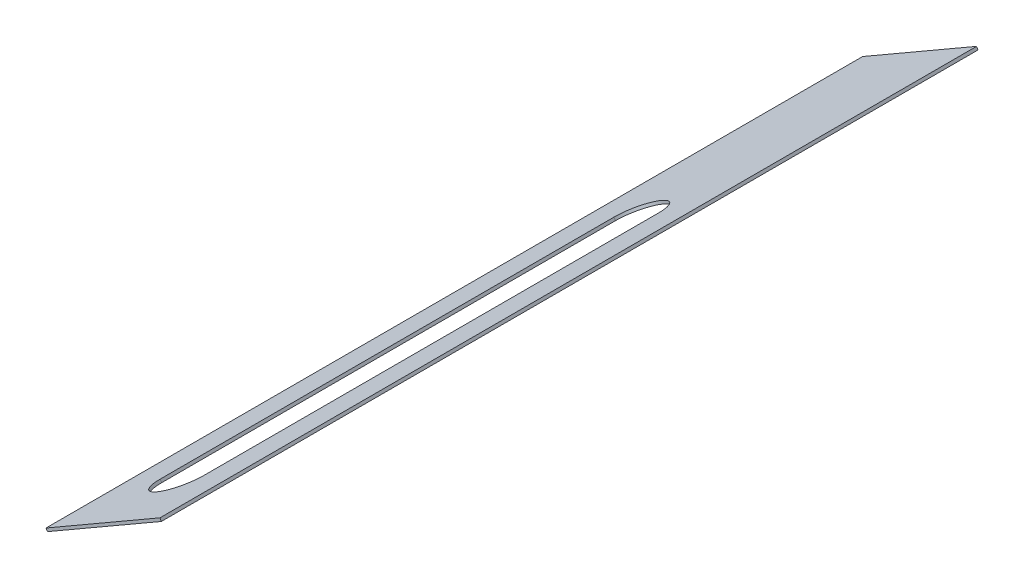
ISO-10303-21;
HEADER;
FILE_DESCRIPTION(('STEP AP214'),'2;1');
FILE_NAME('part.step','',(''),(''),'','','');
FILE_SCHEMA(('AUTOMOTIVE_DESIGN { 1 0 10303 214 1 1 1 1 }'));
ENDSEC;
DATA;
#1=APPLICATION_CONTEXT('core data for automotive mechanical design processes');
#2=APPLICATION_PROTOCOL_DEFINITION('international standard','automotive_design',2000,#1);
#3=PRODUCT_CONTEXT('',#1,'mechanical');
#4=PRODUCT('Part','Part','',(#3));
#5=PRODUCT_RELATED_PRODUCT_CATEGORY('part','',(#4));
#6=PRODUCT_DEFINITION_FORMATION('','',#4);
#7=PRODUCT_DEFINITION_CONTEXT('part definition',#1,'design');
#8=PRODUCT_DEFINITION('design','',#6,#7);
#9=PRODUCT_DEFINITION_SHAPE('','',#8);
#10=(LENGTH_UNIT() NAMED_UNIT(*) SI_UNIT(.MILLI.,.METRE.));
#11=(NAMED_UNIT(*) PLANE_ANGLE_UNIT() SI_UNIT($,.RADIAN.));
#12=(NAMED_UNIT(*) SI_UNIT($,.STERADIAN.) SOLID_ANGLE_UNIT());
#13=UNCERTAINTY_MEASURE_WITH_UNIT(LENGTH_MEASURE(1.E-05),#10,'distance_accuracy_value','');
#14=(GEOMETRIC_REPRESENTATION_CONTEXT(3) GLOBAL_UNCERTAINTY_ASSIGNED_CONTEXT((#13)) GLOBAL_UNIT_ASSIGNED_CONTEXT((#10,
#11,#12)) REPRESENTATION_CONTEXT('',''));
#15=CARTESIAN_POINT('',(0.,0.,0.));
#16=DIRECTION('',(0.,0.,1.));
#17=DIRECTION('',(1.,0.,0.));
#18=AXIS2_PLACEMENT_3D('',#15,#16,#17);
#19=CARTESIAN_POINT('',(-130.757862485378,226.479261314054,914.4));
#20=DIRECTION('',(-0.500000000000017,0.866025403784429,0.));
#21=DIRECTION('',(-0.866025403784429,-0.500000000000017,0.));
#22=AXIS2_PLACEMENT_3D('',#19,#20,#21);
#23=PLANE('',#22);
#24=DIRECTION('',(0.,0.,1.));
#25=VECTOR('',#24,1.);
#26=CARTESIAN_POINT('',(-180.25121429099,197.904261326357,883.505362503567));
#27=LINE('',#26,#25);
#28=CARTESIAN_POINT('',(-180.251214291125,197.904261326591,1650.99999999886));
#29=VERTEX_POINT('',#28);
#30=CARTESIAN_POINT('',(-180.251214277113,197.904261335004,635.000000000381));
#31=VERTEX_POINT('',#30);
#32=EDGE_CURVE('E96',#29,#31,#27,.F.);
#33=ORIENTED_EDGE('',*,*,#32,.T.);
#34=CARTESIAN_POINT('',(-130.757862436667,226.479261343172,635.));
#35=DIRECTION('',(0.500000000000017,-0.866025403784429,0.));
#36=DIRECTION('',(0.866025403784429,0.500000000000017,0.));
#37=AXIS2_PLACEMENT_3D('',#34,#35,#36);
#38=CIRCLE('',#37,57.15);
#39=CARTESIAN_POINT('',(-81.2645107725689,255.054261249474,634.999999999365));
#40=VERTEX_POINT('',#39);
#41=EDGE_CURVE('E95',#31,#40,#38,.T.);
#42=ORIENTED_EDGE('',*,*,#41,.T.);
#43=DIRECTION('',(0.,0.,1.));
#44=VECTOR('',#43,1.);
#45=CARTESIAN_POINT('',(-81.2645107725416,255.054261249427,884.075732803342));
#46=LINE('',#45,#44);
#47=CARTESIAN_POINT('',(-81.2645107725689,255.054261249474,1651.00000000013));
#48=VERTEX_POINT('',#47);
#49=EDGE_CURVE('E67',#48,#40,#46,.F.);
#50=ORIENTED_EDGE('',*,*,#49,.F.);
#51=CARTESIAN_POINT('',(-130.757862436667,226.479261343172,1651.));
#52=DIRECTION('',(0.500000000000017,-0.866025403784429,0.));
#53=DIRECTION('',(0.866025403784429,0.500000000000017,0.));
#54=AXIS2_PLACEMENT_3D('',#51,#52,#53);
#55=CIRCLE('',#54,57.15);
#56=EDGE_CURVE('E64',#48,#29,#55,.T.);
#57=ORIENTED_EDGE('',*,*,#56,.T.);
#58=EDGE_LOOP('',(#33,#42,#50,#57));
#59=FACE_BOUND('',#58,.T.);
#60=DIRECTION('',(-0.866025403784263,-0.500000000000304,0.));
#61=VECTOR('',#60,1.);
#62=CARTESIAN_POINT('',(-3.17499999948723,300.139261313376,1828.8));
#63=LINE('',#62,#61);
#64=CARTESIAN_POINT('',(-3.17499999959338,300.139261313527,1828.8));
#65=VERTEX_POINT('',#64);
#66=CARTESIAN_POINT('',(-258.340724970757,152.819261313636,1828.8));
#67=VERTEX_POINT('',#66);
#68=EDGE_CURVE('E102',#65,#67,#63,.T.);
#69=ORIENTED_EDGE('',*,*,#68,.F.);
#70=DIRECTION('',(0.,0.,1.));
#71=VECTOR('',#70,1.);
#72=CARTESIAN_POINT('',(-3.1749999995132,300.13926131334,1808.3229528099));
#73=LINE('',#72,#71);
#74=CARTESIAN_POINT('',(-3.17499999966125,300.139261313652,0.));
#75=VERTEX_POINT('',#74);
#76=EDGE_CURVE('E120',#65,#75,#73,.F.);
#77=ORIENTED_EDGE('',*,*,#76,.T.);
#78=DIRECTION('',(-0.866025403784289,-0.500000000000258,0.));
#79=VECTOR('',#78,1.);
#80=CARTESIAN_POINT('',(-3.1749999997587,300.139261313876,0.));
#81=LINE('',#80,#79);
#82=CARTESIAN_POINT('',(-258.340724970824,152.819261313766,0.));
#83=VERTEX_POINT('',#82);
#84=EDGE_CURVE('E114',#75,#83,#81,.T.);
#85=ORIENTED_EDGE('',*,*,#84,.T.);
#86=DIRECTION('',(0.,0.,1.));
#87=VECTOR('',#86,1.);
#88=CARTESIAN_POINT('',(-258.340724970592,152.819261313243,1808.3229528099));
#89=LINE('',#88,#87);
#90=EDGE_CURVE('E111',#67,#83,#89,.F.);
#91=ORIENTED_EDGE('',*,*,#90,.F.);
#92=EDGE_LOOP('',(#69,#77,#85,#91));
#93=FACE_BOUND('',#92,.T.);
#94=ADVANCED_FACE('F16',(#59,#93),#23,.T.);
#95=CARTESIAN_POINT('',(-3.17499999996952,300.13926131413,1808.3229528099));
#96=DIRECTION('',(-0.866025403784429,-0.500000000000017,0.));
#97=DIRECTION('',(0.500000000000017,-0.866025403784429,0.));
#98=AXIS2_PLACEMENT_3D('',#95,#96,#97);
#99=PLANE('',#98);
#100=ORIENTED_EDGE('',*,*,#76,.F.);
#101=DIRECTION('',(-0.499999999993256,0.866025403788332,0.));
#102=VECTOR('',#101,1.);
#103=CARTESIAN_POINT('',(5.11590769747272E-10,294.639999999248,1828.8));
#104=LINE('',#103,#102);
#105=CARTESIAN_POINT('',(2.65101758913099E-10,294.639999999678,1828.8));
#106=VERTEX_POINT('',#105);
#107=EDGE_CURVE('E105',#106,#65,#104,.T.);
#108=ORIENTED_EDGE('',*,*,#107,.F.);
#109=DIRECTION('',(0.,0.,1.));
#110=VECTOR('',#109,1.);
#111=CARTESIAN_POINT('',(7.29694082934884E-11,294.639999999987,914.4));
#112=LINE('',#111,#110);
#113=CARTESIAN_POINT('',(1.99384454259432E-10,294.639999999803,0.));
#114=VERTEX_POINT('',#113);
#115=EDGE_CURVE('E91',#106,#114,#112,.F.);
#116=ORIENTED_EDGE('',*,*,#115,.T.);
#117=DIRECTION('',(-0.499999999994137,0.866025403787824,0.));
#118=VECTOR('',#117,1.);
#119=CARTESIAN_POINT('',(2.48689957516035E-10,294.639999999746,0.));
#120=LINE('',#119,#118);
#121=EDGE_CURVE('E117',#114,#75,#120,.T.);
#122=ORIENTED_EDGE('',*,*,#121,.T.);
#123=EDGE_LOOP('',(#100,#108,#116,#122));
#124=FACE_BOUND('',#123,.T.);
#125=ADVANCED_FACE('F204',(#124),#99,.F.);
#126=CARTESIAN_POINT('',(-149.339767936707,215.750993199665,0.));
#127=DIRECTION('',(0.,0.,1.));
#128=DIRECTION('',(1.,0.,0.));
#129=AXIS2_PLACEMENT_3D('',#126,#127,#128);
#130=PLANE('',#129);
#131=ORIENTED_EDGE('',*,*,#84,.F.);
#132=ORIENTED_EDGE('',*,*,#121,.F.);
#133=DIRECTION('',(-0.866025403784429,-0.500000000000017,0.));
#134=VECTOR('',#133,1.);
#135=CARTESIAN_POINT('',(-127.582862485378,220.980000000025,0.));
#136=LINE('',#135,#134);
#137=CARTESIAN_POINT('',(-255.165724970859,147.319999999779,0.));
#138=VERTEX_POINT('',#137);
#139=EDGE_CURVE('E88',#114,#138,#136,.T.);
#140=ORIENTED_EDGE('',*,*,#139,.T.);
#141=DIRECTION('',(0.500000000000017,-0.866025403784429,0.));
#142=VECTOR('',#141,1.);
#143=CARTESIAN_POINT('',(-258.34072497106,152.819261314054,0.));
#144=LINE('',#143,#142);
#145=EDGE_CURVE('E108',#83,#138,#144,.T.);
#146=ORIENTED_EDGE('',*,*,#145,.F.);
#147=EDGE_LOOP('',(#131,#132,#140,#146));
#148=FACE_BOUND('',#147,.T.);
#149=ADVANCED_FACE('F194',(#148),#130,.F.);
#150=CARTESIAN_POINT('',(-258.34072497106,152.819261314054,1808.3229528099));
#151=DIRECTION('',(-0.866025403784429,-0.500000000000017,0.));
#152=DIRECTION('',(0.500000000000017,-0.866025403784429,0.));
#153=AXIS2_PLACEMENT_3D('',#150,#151,#152);
#154=PLANE('',#153);
#155=ORIENTED_EDGE('',*,*,#145,.T.);
#156=DIRECTION('',(0.,0.,1.));
#157=VECTOR('',#156,1.);
#158=CARTESIAN_POINT('',(-255.16572497096,147.319999999988,914.4));
#159=LINE('',#158,#157);
#160=CARTESIAN_POINT('',(-255.165724970807,147.319999999664,1828.8));
#161=VERTEX_POINT('',#160);
#162=EDGE_CURVE('E82',#138,#161,#159,.T.);
#163=ORIENTED_EDGE('',*,*,#162,.T.);
#164=DIRECTION('',(0.500000000004885,-0.866025403781618,0.));
#165=VECTOR('',#164,1.);
#166=CARTESIAN_POINT('',(-258.340724970537,152.819261313255,1828.8));
#167=LINE('',#166,#165);
#168=EDGE_CURVE('E99',#67,#161,#167,.T.);
#169=ORIENTED_EDGE('',*,*,#168,.F.);
#170=ORIENTED_EDGE('',*,*,#90,.T.);
#171=EDGE_LOOP('',(#155,#163,#169,#170));
#172=FACE_BOUND('',#171,.T.);
#173=ADVANCED_FACE('F184',(#172),#154,.T.);
#174=CARTESIAN_POINT('',(432881.944029656,250226.479261306,1828.8));
#175=DIRECTION('',(0.,0.,1.));
#176=DIRECTION('',(1.,0.,0.));
#177=AXIS2_PLACEMENT_3D('',#174,#175,#176);
#178=PLANE('',#177);
#179=ORIENTED_EDGE('',*,*,#168,.T.);
#180=DIRECTION('',(-0.866025403784429,-0.500000000000017,0.));
#181=VECTOR('',#180,1.);
#182=CARTESIAN_POINT('',(-127.582862485378,220.980000000025,1828.8));
#183=LINE('',#182,#181);
#184=EDGE_CURVE('E79',#161,#106,#183,.F.);
#185=ORIENTED_EDGE('',*,*,#184,.T.);
#186=ORIENTED_EDGE('',*,*,#107,.T.);
#187=ORIENTED_EDGE('',*,*,#68,.T.);
#188=EDGE_LOOP('',(#179,#185,#186,#187));
#189=FACE_BOUND('',#188,.T.);
#190=ADVANCED_FACE('F175',(#189),#178,.T.);
#191=CARTESIAN_POINT('',(288741.125730462,-500000.000000032,884.075732803342));
#192=DIRECTION('',(-0.866025403784429,-0.500000000000017,0.));
#193=DIRECTION('',(0.500000000000017,-0.866025403784429,0.));
#194=AXIS2_PLACEMENT_3D('',#191,#192,#193);
#195=PLANE('',#194);
#196=DIRECTION('',(0.,0.,1.));
#197=VECTOR('',#196,1.);
#198=CARTESIAN_POINT('',(-78.0895106804848,249.554999987678,914.4));
#199=LINE('',#198,#197);
#200=CARTESIAN_POINT('',(-78.0895107264123,249.55499996136,634.999999999365));
#201=VERTEX_POINT('',#200);
#202=CARTESIAN_POINT('',(-78.0895107267486,249.554999961931,1651.00000000013));
#203=VERTEX_POINT('',#202);
#204=EDGE_CURVE('E72',#201,#203,#199,.T.);
#205=ORIENTED_EDGE('',*,*,#204,.T.);
#206=DIRECTION('',(0.500000000000017,-0.866025403784429,0.));
#207=VECTOR('',#206,1.);
#208=CARTESIAN_POINT('',(288741.125730462,-500000.000000032,1651.00000000025));
#209=LINE('',#208,#207);
#210=EDGE_CURVE('E19',#203,#48,#209,.F.);
#211=ORIENTED_EDGE('',*,*,#210,.T.);
#212=ORIENTED_EDGE('',*,*,#49,.T.);
#213=DIRECTION('',(0.500000000000017,-0.866025403784429,0.));
#214=VECTOR('',#213,1.);
#215=CARTESIAN_POINT('',(288741.125730462,-500000.000000032,634.99999999873));
#216=LINE('',#215,#214);
#217=EDGE_CURVE('E78',#40,#201,#216,.T.);
#218=ORIENTED_EDGE('',*,*,#217,.T.);
#219=EDGE_LOOP('',(#205,#211,#212,#218));
#220=FACE_BOUND('',#219,.T.);
#221=ADVANCED_FACE('F76',(#220),#195,.T.);
#222=CARTESIAN_POINT('',(288691.632378852,-500028.575000032,1651.));
#223=DIRECTION('',(0.500000000000017,-0.866025403784429,0.));
#224=DIRECTION('',(0.866025403784429,0.500000000000017,0.));
#225=AXIS2_PLACEMENT_3D('',#222,#223,#224);
#226=CYLINDRICAL_SURFACE('',#225,57.15);
#227=ORIENTED_EDGE('',*,*,#56,.F.);
#228=ORIENTED_EDGE('',*,*,#210,.F.);
#229=CARTESIAN_POINT('',(-127.582862436668,220.980000029101,1651.));
#230=DIRECTION('',(0.500000000000017,-0.866025403784429,0.));
#231=DIRECTION('',(0.866025403784429,0.500000000000017,0.));
#232=AXIS2_PLACEMENT_3D('',#229,#230,#231);
#233=CIRCLE('',#232,57.15);
#234=CARTESIAN_POINT('',(-177.076214277137,192.405000020935,1650.99999999886));
#235=VERTEX_POINT('',#234);
#236=EDGE_CURVE('E63',#203,#235,#233,.T.);
#237=ORIENTED_EDGE('',*,*,#236,.T.);
#238=DIRECTION('',(0.500000000000017,-0.866025403784429,0.));
#239=VECTOR('',#238,1.);
#240=CARTESIAN_POINT('',(288455.886733442,-499734.551564585,1650.99999999771));
#241=LINE('',#240,#239);
#242=EDGE_CURVE('E97',#235,#29,#241,.F.);
#243=ORIENTED_EDGE('',*,*,#242,.T.);
#244=EDGE_LOOP('',(#227,#228,#237,#243));
#245=FACE_BOUND('',#244,.T.);
#246=ADVANCED_FACE('F61',(#245),#226,.F.);
#247=CARTESIAN_POINT('',(288455.886733442,-499734.551564585,883.505362503567));
#248=DIRECTION('',(-0.866025403784429,-0.500000000000017,0.));
#249=DIRECTION('',(0.500000000000017,-0.866025403784429,0.));
#250=AXIS2_PLACEMENT_3D('',#247,#248,#249);
#251=PLANE('',#250);
#252=ORIENTED_EDGE('',*,*,#32,.F.);
#253=ORIENTED_EDGE('',*,*,#242,.F.);
#254=DIRECTION('',(0.,0.,1.));
#255=VECTOR('',#254,1.);
#256=CARTESIAN_POINT('',(-177.076214262585,192.405000028357,914.4));
#257=LINE('',#256,#255);
#258=CARTESIAN_POINT('',(-177.076214262622,192.405000028445,635.000000000381));
#259=VERTEX_POINT('',#258);
#260=EDGE_CURVE('E25',#235,#259,#257,.F.);
#261=ORIENTED_EDGE('',*,*,#260,.T.);
#262=DIRECTION('',(0.500000000000017,-0.866025403784429,0.));
#263=VECTOR('',#262,1.);
#264=CARTESIAN_POINT('',(288642.139027026,-500057.150000032,635.000000000762));
#265=LINE('',#264,#263);
#266=EDGE_CURVE('E33',#259,#31,#265,.F.);
#267=ORIENTED_EDGE('',*,*,#266,.T.);
#268=EDGE_LOOP('',(#252,#253,#261,#267));
#269=FACE_BOUND('',#268,.T.);
#270=ADVANCED_FACE('F132',(#269),#251,.F.);
#271=CARTESIAN_POINT('',(288691.632378852,-500028.575000032,635.));
#272=DIRECTION('',(0.500000000000017,-0.866025403784429,0.));
#273=DIRECTION('',(0.866025403784429,0.500000000000017,0.));
#274=AXIS2_PLACEMENT_3D('',#271,#272,#273);
#275=CYLINDRICAL_SURFACE('',#274,57.15);
#276=ORIENTED_EDGE('',*,*,#41,.F.);
#277=ORIENTED_EDGE('',*,*,#266,.F.);
#278=CARTESIAN_POINT('',(-127.582862436327,220.980000028533,635.));
#279=DIRECTION('',(0.500000000000017,-0.866025403784429,0.));
#280=DIRECTION('',(0.866025403784429,0.500000000000017,0.));
#281=AXIS2_PLACEMENT_3D('',#278,#279,#280);
#282=CIRCLE('',#281,57.15);
#283=EDGE_CURVE('E11',#259,#201,#282,.T.);
#284=ORIENTED_EDGE('',*,*,#283,.T.);
#285=ORIENTED_EDGE('',*,*,#217,.F.);
#286=EDGE_LOOP('',(#276,#277,#284,#285));
#287=FACE_BOUND('',#286,.T.);
#288=ADVANCED_FACE('F134',(#287),#275,.F.);
#289=CARTESIAN_POINT('',(-127.582862485378,220.980000000025,914.4));
#290=DIRECTION('',(-0.500000000000017,0.866025403784429,0.));
#291=DIRECTION('',(-0.866025403784429,-0.500000000000017,0.));
#292=AXIS2_PLACEMENT_3D('',#289,#290,#291);
#293=PLANE('',#292);
#294=ORIENTED_EDGE('',*,*,#260,.F.);
#295=ORIENTED_EDGE('',*,*,#236,.F.);
#296=ORIENTED_EDGE('',*,*,#204,.F.);
#297=ORIENTED_EDGE('',*,*,#283,.F.);
#298=EDGE_LOOP('',(#294,#295,#296,#297));
#299=FACE_BOUND('',#298,.T.);
#300=ORIENTED_EDGE('',*,*,#162,.F.);
#301=ORIENTED_EDGE('',*,*,#139,.F.);
#302=ORIENTED_EDGE('',*,*,#115,.F.);
#303=ORIENTED_EDGE('',*,*,#184,.F.);
#304=EDGE_LOOP('',(#300,#301,#302,#303));
#305=FACE_BOUND('',#304,.T.);
#306=ADVANCED_FACE('F70',(#299,#305),#293,.F.);
#307=CLOSED_SHELL('',(#94,#125,#149,#173,#190,#221,#246,#270,#288,#306));
#308=MANIFOLD_SOLID_BREP('B1',#307);
#309=ADVANCED_BREP_SHAPE_REPRESENTATION('',(#18,#308),#14);
#310=SHAPE_DEFINITION_REPRESENTATION(#9,#309);
ENDSEC;
END-ISO-10303-21;
